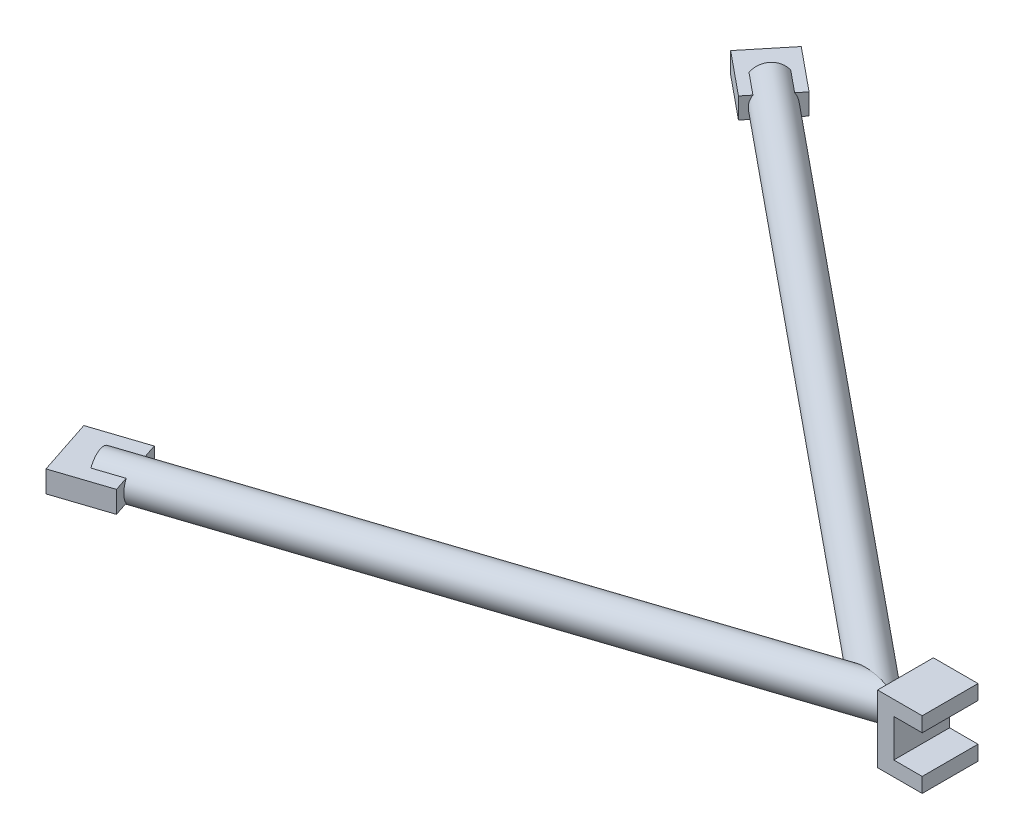
ISO-10303-21;
HEADER;
FILE_DESCRIPTION(('STEP AP214'),'2;1');
FILE_NAME('part.step','',(''),(''),'','','');
FILE_SCHEMA(('AUTOMOTIVE_DESIGN { 1 0 10303 214 1 1 1 1 }'));
ENDSEC;
DATA;
#1=APPLICATION_CONTEXT('core data for automotive mechanical design processes');
#2=APPLICATION_PROTOCOL_DEFINITION('international standard','automotive_design',2000,#1);
#3=PRODUCT_CONTEXT('',#1,'mechanical');
#4=PRODUCT('Part','Part','',(#3));
#5=PRODUCT_RELATED_PRODUCT_CATEGORY('part','',(#4));
#6=PRODUCT_DEFINITION_FORMATION('','',#4);
#7=PRODUCT_DEFINITION_CONTEXT('part definition',#1,'design');
#8=PRODUCT_DEFINITION('design','',#6,#7);
#9=PRODUCT_DEFINITION_SHAPE('','',#8);
#10=(LENGTH_UNIT() NAMED_UNIT(*) SI_UNIT(.MILLI.,.METRE.));
#11=(NAMED_UNIT(*) PLANE_ANGLE_UNIT() SI_UNIT($,.RADIAN.));
#12=(NAMED_UNIT(*) SI_UNIT($,.STERADIAN.) SOLID_ANGLE_UNIT());
#13=UNCERTAINTY_MEASURE_WITH_UNIT(LENGTH_MEASURE(1.E-05),#10,'distance_accuracy_value','');
#14=(GEOMETRIC_REPRESENTATION_CONTEXT(3) GLOBAL_UNCERTAINTY_ASSIGNED_CONTEXT((#13)) GLOBAL_UNIT_ASSIGNED_CONTEXT((#10,
#11,#12)) REPRESENTATION_CONTEXT('',''));
#15=CARTESIAN_POINT('',(0.,0.,0.));
#16=DIRECTION('',(0.,0.,1.));
#17=DIRECTION('',(1.,0.,0.));
#18=AXIS2_PLACEMENT_3D('',#15,#16,#17);
#19=CARTESIAN_POINT('',(-265.319834303481,0.,-217.222916666667));
#20=DIRECTION('',(-0.773752797618783,0.,-0.633487654320988));
#21=DIRECTION('',(-0.633487654320988,0.,0.773752797618783));
#22=AXIS2_PLACEMENT_3D('',#19,#20,#21);
#23=PLANE('',#22);
#24=DIRECTION('',(-0.633487654320988,0.,0.773752797618783));
#25=VECTOR('',#24,1.);
#26=CARTESIAN_POINT('',(-265.319834303481,-4.76050228622395,-217.222916666667));
#27=LINE('',#26,#25);
#28=CARTESIAN_POINT('',(-261.047541571658,-4.76050228622395,-222.441169036616));
#29=VERTEX_POINT('',#28);
#30=CARTESIAN_POINT('',(-269.592127035303,-4.76050228622395,-212.004664296718));
#31=VERTEX_POINT('',#30);
#32=EDGE_CURVE('E265',#29,#31,#27,.T.);
#33=ORIENTED_EDGE('',*,*,#32,.F.);
#34=CARTESIAN_POINT('',(-265.319834303481,0.,-217.222916666667));
#35=DIRECTION('',(-0.773752797618783,0.,-0.633487654320988));
#36=DIRECTION('',(-0.633487654320988,0.,0.773752797618783));
#37=AXIS2_PLACEMENT_3D('',#34,#35,#36);
#38=CIRCLE('',#37,8.25499999999999);
#39=EDGE_CURVE('E413',#29,#31,#38,.T.);
#40=ORIENTED_EDGE('',*,*,#39,.T.);
#41=EDGE_LOOP('',(#33,#40));
#42=FACE_BOUND('',#41,.T.);
#43=ADVANCED_FACE('F39',(#42),#23,.T.);
#44=CARTESIAN_POINT('',(-265.319834303481,0.,87.5770833333333));
#45=DIRECTION('',(0.949605706168506,0.,-0.31344696969697));
#46=DIRECTION('',(-0.31344696969697,0.,-0.949605706168506));
#47=AXIS2_PLACEMENT_3D('',#44,#45,#46);
#48=PLANE('',#47);
#49=CARTESIAN_POINT('',(-265.319834303481,0.,87.5770833333333));
#50=DIRECTION('',(0.949605706168506,0.,-0.31344696969697));
#51=DIRECTION('',(-0.31344696969697,0.,-0.949605706168506));
#52=AXIS2_PLACEMENT_3D('',#49,#50,#51);
#53=CIRCLE('',#52,8.25499999999999);
#54=CARTESIAN_POINT('',(-263.245783522506,-4.93573808779041,93.8605400162964));
#55=VERTEX_POINT('',#54);
#56=CARTESIAN_POINT('',(-267.393885084455,-4.93573808779042,81.2936266503703));
#57=VERTEX_POINT('',#56);
#58=EDGE_CURVE('E419',#55,#57,#53,.T.);
#59=ORIENTED_EDGE('',*,*,#58,.F.);
#60=DIRECTION('',(-0.31344696969697,0.,-0.949605706168506));
#61=VECTOR('',#60,1.);
#62=CARTESIAN_POINT('',(-265.319834303481,-4.93573808779042,87.5770833333333));
#63=LINE('',#62,#61);
#64=EDGE_CURVE('E317',#55,#57,#63,.T.);
#65=ORIENTED_EDGE('',*,*,#64,.T.);
#66=EDGE_LOOP('',(#59,#65));
#67=FACE_BOUND('',#66,.T.);
#68=ADVANCED_FACE('F487',(#67),#48,.F.);
#69=DIRECTION('',(0.633487654320988,0.,-0.773752797618783));
#70=VECTOR('',#69,1.);
#71=CARTESIAN_POINT('',(-265.319834303481,4.76050228622395,-217.222916666667));
#72=LINE('',#71,#70);
#73=CARTESIAN_POINT('',(-269.592127035303,4.76050228622395,-212.004664296718));
#74=VERTEX_POINT('',#73);
#75=CARTESIAN_POINT('',(-261.047541571658,4.76050228622395,-222.441169036616));
#76=VERTEX_POINT('',#75);
#77=EDGE_CURVE('E257',#74,#76,#72,.T.);
#78=ORIENTED_EDGE('',*,*,#77,.F.);
#79=EDGE_CURVE('E423',#74,#76,#38,.T.);
#80=ORIENTED_EDGE('',*,*,#79,.T.);
#81=EDGE_LOOP('',(#78,#80));
#82=FACE_BOUND('',#81,.T.);
#83=ADVANCED_FACE('F41',(#82),#23,.T.);
#84=CARTESIAN_POINT('',(-267.393885084455,4.93573808779041,81.2936266503703));
#85=VERTEX_POINT('',#84);
#86=CARTESIAN_POINT('',(-263.245783522506,4.93573808779042,93.8605400162964));
#87=VERTEX_POINT('',#86);
#88=EDGE_CURVE('E414',#85,#87,#53,.T.);
#89=ORIENTED_EDGE('',*,*,#88,.F.);
#90=DIRECTION('',(0.31344696969697,0.,0.949605706168506));
#91=VECTOR('',#90,1.);
#92=CARTESIAN_POINT('',(-265.319834303481,4.93573808779042,87.5770833333333));
#93=LINE('',#92,#91);
#94=EDGE_CURVE('E305',#85,#87,#93,.T.);
#95=ORIENTED_EDGE('',*,*,#94,.T.);
#96=EDGE_LOOP('',(#89,#95));
#97=FACE_BOUND('',#96,.T.);
#98=ADVANCED_FACE('F495',(#97),#48,.F.);
#99=CARTESIAN_POINT('',(12.8643448013669,0.,10.5323090755523));
#100=DIRECTION('',(-0.773752797618783,0.,-0.633487654320988));
#101=DIRECTION('',(-0.633487654320988,0.,0.773752797618783));
#102=AXIS2_PLACEMENT_3D('',#99,#100,#101);
#103=CYLINDRICAL_SURFACE('',#102,8.25499999999999);
#104=DIRECTION('',(-0.773752797618783,0.,-0.633487654320988));
#105=VECTOR('',#104,1.);
#106=CARTESIAN_POINT('',(17.1366375331891,-4.76050228622395,5.31405670560353));
#107=LINE('',#106,#105);
#108=CARTESIAN_POINT('',(-251.2208810419,-4.76050228622395,-214.395875826739));
#109=VERTEX_POINT('',#108);
#110=EDGE_CURVE('E11',#109,#29,#107,.T.);
#111=ORIENTED_EDGE('',*,*,#110,.F.);
#112=CARTESIAN_POINT('',(-255.493173773722,0.,-209.17762345679));
#113=DIRECTION('',(-0.773752797618783,0.,-0.633487654320988));
#114=DIRECTION('',(-0.633487654320988,0.,0.773752797618783));
#115=AXIS2_PLACEMENT_3D('',#112,#113,#114);
#116=CIRCLE('',#115,8.25499999999999);
#117=CARTESIAN_POINT('',(-251.2208810419,4.76050228622395,-214.395875826739));
#118=VERTEX_POINT('',#117);
#119=EDGE_CURVE('E452',#109,#118,#116,.F.);
#120=ORIENTED_EDGE('',*,*,#119,.T.);
#121=DIRECTION('',(-0.773752797618783,0.,-0.633487654320988));
#122=VECTOR('',#121,1.);
#123=CARTESIAN_POINT('',(17.1366375331891,4.76050228622395,5.31405670560353));
#124=LINE('',#123,#122);
#125=EDGE_CURVE('E48',#76,#118,#124,.F.);
#126=ORIENTED_EDGE('',*,*,#125,.F.);
#127=ORIENTED_EDGE('',*,*,#79,.F.);
#128=DIRECTION('',(-0.773752797618783,0.,-0.633487654320988));
#129=VECTOR('',#128,1.);
#130=CARTESIAN_POINT('',(8.59205206954476,4.76050228622395,15.7505614455011));
#131=LINE('',#130,#129);
#132=CARTESIAN_POINT('',(-259.765466505544,4.76050228622395,-203.959371086841));
#133=VERTEX_POINT('',#132);
#134=EDGE_CURVE('E451',#133,#74,#131,.T.);
#135=ORIENTED_EDGE('',*,*,#134,.F.);
#136=CARTESIAN_POINT('',(-259.765466505544,-4.76050228622395,-203.959371086841));
#137=VERTEX_POINT('',#136);
#138=EDGE_CURVE('E447',#133,#137,#116,.F.);
#139=ORIENTED_EDGE('',*,*,#138,.T.);
#140=DIRECTION('',(-0.773752797618783,0.,-0.633487654320988));
#141=VECTOR('',#140,1.);
#142=CARTESIAN_POINT('',(8.59205206954476,-4.76050228622395,15.7505614455011));
#143=LINE('',#142,#141);
#144=EDGE_CURVE('E455',#31,#137,#143,.F.);
#145=ORIENTED_EDGE('',*,*,#144,.F.);
#146=ORIENTED_EDGE('',*,*,#39,.F.);
#147=EDGE_LOOP('',(#111,#120,#126,#127,#135,#139,#145,#146));
#148=FACE_BOUND('',#147,.T.);
#149=CARTESIAN_POINT('',(13.6293656524409,0.,11.1586477019779));
#150=DIRECTION('',(-1.,0.,0.));
#151=DIRECTION('',(0.,0.,-1.));
#152=AXIS2_PLACEMENT_3D('',#149,#150,#151);
#153=ELLIPSE('',#152,10.6687821037994,8.25499999999999);
#154=CARTESIAN_POINT('',(13.6293656524409,-4.85605676273907,2.53107609636206));
#155=VERTEX_POINT('',#154);
#156=CARTESIAN_POINT('',(13.6293656524409,4.85605676273907,2.53107609636206));
#157=VERTEX_POINT('',#156);
#158=EDGE_CURVE('E389',#155,#157,#153,.F.);
#159=ORIENTED_EDGE('',*,*,#158,.F.);
#160=CARTESIAN_POINT('',(0.,0.,0.));
#161=DIRECTION('',(0.182585791656968,0.,-0.983189925032289));
#162=DIRECTION('',(0.983189925032289,0.,0.182585791656968));
#163=AXIS2_PLACEMENT_3D('',#160,#161,#162);
#164=ELLIPSE('',#163,17.1421186326536,8.25499999999999);
#165=EDGE_CURVE('E418',#157,#155,#164,.F.);
#166=ORIENTED_EDGE('',*,*,#165,.F.);
#167=EDGE_LOOP('',(#159,#166));
#168=FACE_BOUND('',#167,.T.);
#169=ADVANCED_FACE('F464',(#148,#168),#103,.T.);
#170=CARTESIAN_POINT('',(-265.319834303481,0.,87.5770833333333));
#171=DIRECTION('',(0.949605706168506,0.,-0.31344696969697));
#172=DIRECTION('',(-0.31344696969697,0.,-0.949605706168506));
#173=AXIS2_PLACEMENT_3D('',#170,#171,#172);
#174=CYLINDRICAL_SURFACE('',#173,8.25499999999999);
#175=DIRECTION('',(0.949605706168506,0.,-0.31344696969697));
#176=VECTOR('',#175,1.);
#177=CARTESIAN_POINT('',(-267.393885084455,-4.93573808779041,81.2936266503703));
#178=LINE('',#177,#176);
#179=CARTESIAN_POINT('',(-255.333892616115,-4.93573808779042,77.3128501352188));
#180=VERTEX_POINT('',#179);
#181=EDGE_CURVE('E444',#180,#57,#178,.F.);
#182=ORIENTED_EDGE('',*,*,#181,.F.);
#183=CARTESIAN_POINT('',(-253.25984183514,0.,83.5963068181818));
#184=DIRECTION('',(-0.949605706168506,0.,0.31344696969697));
#185=DIRECTION('',(0.31344696969697,0.,0.949605706168506));
#186=AXIS2_PLACEMENT_3D('',#183,#184,#185);
#187=CIRCLE('',#186,8.25499999999999);
#188=CARTESIAN_POINT('',(-255.333892616115,4.93573808779042,77.3128501352188));
#189=VERTEX_POINT('',#188);
#190=EDGE_CURVE('E435',#180,#189,#187,.F.);
#191=ORIENTED_EDGE('',*,*,#190,.T.);
#192=DIRECTION('',(0.949605706168506,0.,-0.31344696969697));
#193=VECTOR('',#192,1.);
#194=CARTESIAN_POINT('',(-267.393885084455,4.93573808779041,81.2936266503703));
#195=LINE('',#194,#193);
#196=EDGE_CURVE('E441',#85,#189,#195,.T.);
#197=ORIENTED_EDGE('',*,*,#196,.F.);
#198=ORIENTED_EDGE('',*,*,#88,.T.);
#199=DIRECTION('',(0.949605706168506,0.,-0.31344696969697));
#200=VECTOR('',#199,1.);
#201=CARTESIAN_POINT('',(-263.245783522506,4.93573808779041,93.8605400162964));
#202=LINE('',#201,#200);
#203=CARTESIAN_POINT('',(-251.185791054166,4.93573808779042,89.8797635011448));
#204=VERTEX_POINT('',#203);
#205=EDGE_CURVE('E434',#204,#87,#202,.F.);
#206=ORIENTED_EDGE('',*,*,#205,.F.);
#207=CARTESIAN_POINT('',(-251.185791054166,-4.93573808779042,89.8797635011448));
#208=VERTEX_POINT('',#207);
#209=EDGE_CURVE('E430',#204,#208,#187,.F.);
#210=ORIENTED_EDGE('',*,*,#209,.T.);
#211=DIRECTION('',(0.949605706168506,0.,-0.31344696969697));
#212=VECTOR('',#211,1.);
#213=CARTESIAN_POINT('',(-263.245783522506,-4.93573808779041,93.8605400162964));
#214=LINE('',#213,#212);
#215=EDGE_CURVE('E438',#55,#208,#214,.T.);
#216=ORIENTED_EDGE('',*,*,#215,.F.);
#217=ORIENTED_EDGE('',*,*,#58,.T.);
#218=EDGE_LOOP('',(#182,#191,#197,#198,#206,#210,#216,#217));
#219=FACE_BOUND('',#218,.T.);
#220=CARTESIAN_POINT('',(13.6293656524409,0.,-4.49879706376942));
#221=DIRECTION('',(-1.,0.,0.));
#222=DIRECTION('',(0.,0.,-1.));
#223=AXIS2_PLACEMENT_3D('',#220,#221,#222);
#224=ELLIPSE('',#223,8.69308171420692,8.25499999999999);
#225=EDGE_CURVE('E422',#157,#155,#224,.F.);
#226=ORIENTED_EDGE('',*,*,#225,.F.);
#227=ORIENTED_EDGE('',*,*,#165,.T.);
#228=EDGE_LOOP('',(#226,#227));
#229=FACE_BOUND('',#228,.T.);
#230=ADVANCED_FACE('F496',(#219,#229),#174,.T.);
#231=CARTESIAN_POINT('',(33.9317533676103,8.5937968108698,-12.7));
#232=DIRECTION('',(1.,0.,0.));
#233=DIRECTION('',(0.,1.,0.));
#234=AXIS2_PLACEMENT_3D('',#231,#232,#233);
#235=PLANE('',#234);
#236=DIRECTION('',(0.,0.,1.));
#237=VECTOR('',#236,1.);
#238=CARTESIAN_POINT('',(33.9317533676103,15.315544540046,-12.7));
#239=LINE('',#238,#237);
#240=CARTESIAN_POINT('',(33.9317533676103,15.315544540046,-12.7));
#241=VERTEX_POINT('',#240);
#242=CARTESIAN_POINT('',(33.9317533676103,15.315544540046,12.7));
#243=VERTEX_POINT('',#242);
#244=EDGE_CURVE('E385',#241,#243,#239,.T.);
#245=ORIENTED_EDGE('',*,*,#244,.T.);
#246=DIRECTION('',(0.,1.,0.));
#247=VECTOR('',#246,1.);
#248=CARTESIAN_POINT('',(33.9317533676103,8.5937968108698,12.7));
#249=LINE('',#248,#247);
#250=CARTESIAN_POINT('',(33.9317533676103,8.5937968108698,12.7));
#251=VERTEX_POINT('',#250);
#252=EDGE_CURVE('E321',#251,#243,#249,.T.);
#253=ORIENTED_EDGE('',*,*,#252,.F.);
#254=DIRECTION('',(0.,0.,1.));
#255=VECTOR('',#254,1.);
#256=CARTESIAN_POINT('',(33.9317533676103,8.5937968108698,-12.7));
#257=LINE('',#256,#255);
#258=CARTESIAN_POINT('',(33.9317533676103,8.5937968108698,-12.7));
#259=VERTEX_POINT('',#258);
#260=EDGE_CURVE('E386',#259,#251,#257,.T.);
#261=ORIENTED_EDGE('',*,*,#260,.F.);
#262=DIRECTION('',(0.,1.,0.));
#263=VECTOR('',#262,1.);
#264=CARTESIAN_POINT('',(33.9317533676103,8.5937968108698,-12.7));
#265=LINE('',#264,#263);
#266=EDGE_CURVE('E353',#259,#241,#265,.T.);
#267=ORIENTED_EDGE('',*,*,#266,.T.);
#268=EDGE_LOOP('',(#245,#253,#261,#267));
#269=FACE_BOUND('',#268,.T.);
#270=ADVANCED_FACE('F498',(#269),#235,.T.);
#271=CARTESIAN_POINT('',(21.0045844286355,8.5937968108698,-12.7));
#272=DIRECTION('',(0.,-1.,0.));
#273=DIRECTION('',(0.,0.,-1.));
#274=AXIS2_PLACEMENT_3D('',#271,#272,#273);
#275=PLANE('',#274);
#276=ORIENTED_EDGE('',*,*,#260,.T.);
#277=DIRECTION('',(1.,0.,0.));
#278=VECTOR('',#277,1.);
#279=CARTESIAN_POINT('',(21.0045844286355,8.5937968108698,12.7));
#280=LINE('',#279,#278);
#281=CARTESIAN_POINT('',(21.0045844286355,8.5937968108698,12.7));
#282=VERTEX_POINT('',#281);
#283=EDGE_CURVE('E349',#282,#251,#280,.T.);
#284=ORIENTED_EDGE('',*,*,#283,.F.);
#285=DIRECTION('',(0.,0.,1.));
#286=VECTOR('',#285,1.);
#287=CARTESIAN_POINT('',(21.0045844286355,8.5937968108698,-12.7));
#288=LINE('',#287,#286);
#289=CARTESIAN_POINT('',(21.0045844286355,8.5937968108698,-12.7));
#290=VERTEX_POINT('',#289);
#291=EDGE_CURVE('E390',#290,#282,#288,.T.);
#292=ORIENTED_EDGE('',*,*,#291,.F.);
#293=DIRECTION('',(1.,0.,0.));
#294=VECTOR('',#293,1.);
#295=CARTESIAN_POINT('',(21.0045844286355,8.5937968108698,-12.7));
#296=LINE('',#295,#294);
#297=EDGE_CURVE('E381',#290,#259,#296,.T.);
#298=ORIENTED_EDGE('',*,*,#297,.T.);
#299=EDGE_LOOP('',(#276,#284,#292,#298));
#300=FACE_BOUND('',#299,.T.);
#301=ADVANCED_FACE('F506',(#300),#275,.T.);
#302=CARTESIAN_POINT('',(21.0045844286355,-8.5937968108698,-12.7));
#303=DIRECTION('',(1.,0.,0.));
#304=DIRECTION('',(0.,1.,0.));
#305=AXIS2_PLACEMENT_3D('',#302,#303,#304);
#306=PLANE('',#305);
#307=ORIENTED_EDGE('',*,*,#291,.T.);
#308=DIRECTION('',(0.,1.,0.));
#309=VECTOR('',#308,1.);
#310=CARTESIAN_POINT('',(21.0045844286355,-8.5937968108698,12.7));
#311=LINE('',#310,#309);
#312=CARTESIAN_POINT('',(21.0045844286355,-8.5937968108698,12.7));
#313=VERTEX_POINT('',#312);
#314=EDGE_CURVE('E345',#313,#282,#311,.T.);
#315=ORIENTED_EDGE('',*,*,#314,.F.);
#316=DIRECTION('',(0.,0.,1.));
#317=VECTOR('',#316,1.);
#318=CARTESIAN_POINT('',(21.0045844286355,-8.5937968108698,-12.7));
#319=LINE('',#318,#317);
#320=CARTESIAN_POINT('',(21.0045844286355,-8.5937968108698,-12.7));
#321=VERTEX_POINT('',#320);
#322=EDGE_CURVE('E393',#321,#313,#319,.T.);
#323=ORIENTED_EDGE('',*,*,#322,.F.);
#324=DIRECTION('',(0.,1.,0.));
#325=VECTOR('',#324,1.);
#326=CARTESIAN_POINT('',(21.0045844286355,-8.5937968108698,-12.7));
#327=LINE('',#326,#325);
#328=EDGE_CURVE('E377',#321,#290,#327,.T.);
#329=ORIENTED_EDGE('',*,*,#328,.T.);
#330=EDGE_LOOP('',(#307,#315,#323,#329));
#331=FACE_BOUND('',#330,.T.);
#332=ADVANCED_FACE('F513',(#331),#306,.T.);
#333=CARTESIAN_POINT('',(33.9317533676103,-8.59379681086979,-12.7));
#334=DIRECTION('',(0.,1.,0.));
#335=DIRECTION('',(-1.,0.,0.));
#336=AXIS2_PLACEMENT_3D('',#333,#334,#335);
#337=PLANE('',#336);
#338=ORIENTED_EDGE('',*,*,#322,.T.);
#339=DIRECTION('',(-1.,0.,0.));
#340=VECTOR('',#339,1.);
#341=CARTESIAN_POINT('',(33.9317533676103,-8.59379681086979,12.7));
#342=LINE('',#341,#340);
#343=CARTESIAN_POINT('',(33.9317533676103,-8.59379681086979,12.7));
#344=VERTEX_POINT('',#343);
#345=EDGE_CURVE('E341',#344,#313,#342,.T.);
#346=ORIENTED_EDGE('',*,*,#345,.F.);
#347=DIRECTION('',(0.,0.,1.));
#348=VECTOR('',#347,1.);
#349=CARTESIAN_POINT('',(33.9317533676103,-8.59379681086979,-12.7));
#350=LINE('',#349,#348);
#351=CARTESIAN_POINT('',(33.9317533676103,-8.59379681086979,-12.7));
#352=VERTEX_POINT('',#351);
#353=EDGE_CURVE('E396',#352,#344,#350,.T.);
#354=ORIENTED_EDGE('',*,*,#353,.F.);
#355=DIRECTION('',(-1.,0.,0.));
#356=VECTOR('',#355,1.);
#357=CARTESIAN_POINT('',(33.9317533676103,-8.59379681086979,-12.7));
#358=LINE('',#357,#356);
#359=EDGE_CURVE('E373',#352,#321,#358,.T.);
#360=ORIENTED_EDGE('',*,*,#359,.T.);
#361=EDGE_LOOP('',(#338,#346,#354,#360));
#362=FACE_BOUND('',#361,.T.);
#363=ADVANCED_FACE('F640',(#362),#337,.T.);
#364=CARTESIAN_POINT('',(33.9317533676103,-15.315544540046,-12.7));
#365=DIRECTION('',(1.,0.,0.));
#366=DIRECTION('',(0.,0.,-1.));
#367=AXIS2_PLACEMENT_3D('',#364,#365,#366);
#368=PLANE('',#367);
#369=ORIENTED_EDGE('',*,*,#353,.T.);
#370=DIRECTION('',(0.,1.,0.));
#371=VECTOR('',#370,1.);
#372=CARTESIAN_POINT('',(33.9317533676103,-15.315544540046,12.7));
#373=LINE('',#372,#371);
#374=CARTESIAN_POINT('',(33.9317533676103,-15.315544540046,12.7));
#375=VERTEX_POINT('',#374);
#376=EDGE_CURVE('E337',#375,#344,#373,.T.);
#377=ORIENTED_EDGE('',*,*,#376,.F.);
#378=DIRECTION('',(0.,0.,1.));
#379=VECTOR('',#378,1.);
#380=CARTESIAN_POINT('',(33.9317533676103,-15.315544540046,-12.7));
#381=LINE('',#380,#379);
#382=CARTESIAN_POINT('',(33.9317533676103,-15.315544540046,-12.7));
#383=VERTEX_POINT('',#382);
#384=EDGE_CURVE('E399',#383,#375,#381,.T.);
#385=ORIENTED_EDGE('',*,*,#384,.F.);
#386=DIRECTION('',(0.,1.,0.));
#387=VECTOR('',#386,1.);
#388=CARTESIAN_POINT('',(33.9317533676103,-15.315544540046,-12.7));
#389=LINE('',#388,#387);
#390=EDGE_CURVE('E369',#383,#352,#389,.T.);
#391=ORIENTED_EDGE('',*,*,#390,.T.);
#392=EDGE_LOOP('',(#369,#377,#385,#391));
#393=FACE_BOUND('',#392,.T.);
#394=ADVANCED_FACE('F644',(#393),#368,.T.);
#395=CARTESIAN_POINT('',(13.6293656524409,-15.315544540046,-12.7));
#396=DIRECTION('',(0.,-1.,0.));
#397=DIRECTION('',(0.,0.,-1.));
#398=AXIS2_PLACEMENT_3D('',#395,#396,#397);
#399=PLANE('',#398);
#400=ORIENTED_EDGE('',*,*,#384,.T.);
#401=DIRECTION('',(1.,0.,0.));
#402=VECTOR('',#401,1.);
#403=CARTESIAN_POINT('',(13.6293656524409,-15.315544540046,12.7));
#404=LINE('',#403,#402);
#405=CARTESIAN_POINT('',(13.6293656524409,-15.315544540046,12.7));
#406=VERTEX_POINT('',#405);
#407=EDGE_CURVE('E333',#406,#375,#404,.T.);
#408=ORIENTED_EDGE('',*,*,#407,.F.);
#409=DIRECTION('',(0.,0.,1.));
#410=VECTOR('',#409,1.);
#411=CARTESIAN_POINT('',(13.6293656524409,-15.315544540046,-12.7));
#412=LINE('',#411,#410);
#413=CARTESIAN_POINT('',(13.6293656524409,-15.315544540046,-12.7));
#414=VERTEX_POINT('',#413);
#415=EDGE_CURVE('E402',#414,#406,#412,.T.);
#416=ORIENTED_EDGE('',*,*,#415,.F.);
#417=DIRECTION('',(1.,0.,0.));
#418=VECTOR('',#417,1.);
#419=CARTESIAN_POINT('',(13.6293656524409,-15.315544540046,-12.7));
#420=LINE('',#419,#418);
#421=EDGE_CURVE('E365',#414,#383,#420,.T.);
#422=ORIENTED_EDGE('',*,*,#421,.T.);
#423=EDGE_LOOP('',(#400,#408,#416,#422));
#424=FACE_BOUND('',#423,.T.);
#425=ADVANCED_FACE('F648',(#424),#399,.T.);
#426=CARTESIAN_POINT('',(13.6293656524409,15.315544540046,-12.7));
#427=DIRECTION('',(-1.,0.,0.));
#428=DIRECTION('',(0.,-1.,0.));
#429=AXIS2_PLACEMENT_3D('',#426,#427,#428);
#430=PLANE('',#429);
#431=ORIENTED_EDGE('',*,*,#225,.T.);
#432=ORIENTED_EDGE('',*,*,#158,.T.);
#433=EDGE_LOOP('',(#431,#432));
#434=FACE_BOUND('',#433,.T.);
#435=ORIENTED_EDGE('',*,*,#415,.T.);
#436=DIRECTION('',(0.,-1.,0.));
#437=VECTOR('',#436,1.);
#438=CARTESIAN_POINT('',(13.6293656524409,15.315544540046,12.7));
#439=LINE('',#438,#437);
#440=CARTESIAN_POINT('',(13.6293656524409,15.315544540046,12.7));
#441=VERTEX_POINT('',#440);
#442=EDGE_CURVE('E329',#441,#406,#439,.T.);
#443=ORIENTED_EDGE('',*,*,#442,.F.);
#444=DIRECTION('',(0.,0.,1.));
#445=VECTOR('',#444,1.);
#446=CARTESIAN_POINT('',(13.6293656524409,15.315544540046,-12.7));
#447=LINE('',#446,#445);
#448=CARTESIAN_POINT('',(13.6293656524409,15.315544540046,-12.7));
#449=VERTEX_POINT('',#448);
#450=EDGE_CURVE('E405',#449,#441,#447,.T.);
#451=ORIENTED_EDGE('',*,*,#450,.F.);
#452=DIRECTION('',(0.,-1.,0.));
#453=VECTOR('',#452,1.);
#454=CARTESIAN_POINT('',(13.6293656524409,15.315544540046,-12.7));
#455=LINE('',#454,#453);
#456=EDGE_CURVE('E361',#449,#414,#455,.T.);
#457=ORIENTED_EDGE('',*,*,#456,.T.);
#458=EDGE_LOOP('',(#435,#443,#451,#457));
#459=FACE_BOUND('',#458,.T.);
#460=ADVANCED_FACE('F651',(#434,#459),#430,.T.);
#461=CARTESIAN_POINT('',(33.9317533676103,15.315544540046,-12.7));
#462=DIRECTION('',(0.,1.,0.));
#463=DIRECTION('',(-1.,0.,0.));
#464=AXIS2_PLACEMENT_3D('',#461,#462,#463);
#465=PLANE('',#464);
#466=ORIENTED_EDGE('',*,*,#450,.T.);
#467=DIRECTION('',(-1.,0.,0.));
#468=VECTOR('',#467,1.);
#469=CARTESIAN_POINT('',(33.9317533676103,15.315544540046,12.7));
#470=LINE('',#469,#468);
#471=EDGE_CURVE('E325',#243,#441,#470,.T.);
#472=ORIENTED_EDGE('',*,*,#471,.F.);
#473=ORIENTED_EDGE('',*,*,#244,.F.);
#474=DIRECTION('',(-1.,0.,0.));
#475=VECTOR('',#474,1.);
#476=CARTESIAN_POINT('',(33.9317533676103,15.315544540046,-12.7));
#477=LINE('',#476,#475);
#478=EDGE_CURVE('E357',#241,#449,#477,.T.);
#479=ORIENTED_EDGE('',*,*,#478,.T.);
#480=EDGE_LOOP('',(#466,#472,#473,#479));
#481=FACE_BOUND('',#480,.T.);
#482=ADVANCED_FACE('F520',(#481),#465,.T.);
#483=CARTESIAN_POINT('',(0.,0.,-12.7));
#484=DIRECTION('',(0.,0.,1.));
#485=DIRECTION('',(1.,0.,0.));
#486=AXIS2_PLACEMENT_3D('',#483,#484,#485);
#487=PLANE('',#486);
#488=ORIENTED_EDGE('',*,*,#266,.F.);
#489=ORIENTED_EDGE('',*,*,#297,.F.);
#490=ORIENTED_EDGE('',*,*,#328,.F.);
#491=ORIENTED_EDGE('',*,*,#359,.F.);
#492=ORIENTED_EDGE('',*,*,#390,.F.);
#493=ORIENTED_EDGE('',*,*,#421,.F.);
#494=ORIENTED_EDGE('',*,*,#456,.F.);
#495=ORIENTED_EDGE('',*,*,#478,.F.);
#496=EDGE_LOOP('',(#488,#489,#490,#491,#492,#493,#494,#495));
#497=FACE_BOUND('',#496,.T.);
#498=ADVANCED_FACE('F633',(#497),#487,.F.);
#499=CARTESIAN_POINT('',(0.,0.,12.7));
#500=DIRECTION('',(0.,0.,1.));
#501=DIRECTION('',(1.,0.,0.));
#502=AXIS2_PLACEMENT_3D('',#499,#500,#501);
#503=PLANE('',#502);
#504=ORIENTED_EDGE('',*,*,#252,.T.);
#505=ORIENTED_EDGE('',*,*,#471,.T.);
#506=ORIENTED_EDGE('',*,*,#442,.T.);
#507=ORIENTED_EDGE('',*,*,#407,.T.);
#508=ORIENTED_EDGE('',*,*,#376,.T.);
#509=ORIENTED_EDGE('',*,*,#345,.T.);
#510=ORIENTED_EDGE('',*,*,#314,.T.);
#511=ORIENTED_EDGE('',*,*,#283,.T.);
#512=EDGE_LOOP('',(#504,#505,#506,#507,#508,#509,#510,#511));
#513=FACE_BOUND('',#512,.T.);
#514=ADVANCED_FACE('F630',(#513),#503,.T.);
#515=CARTESIAN_POINT('',(-253.25984183514,0.,83.5963068181818));
#516=DIRECTION('',(-0.949605706168506,0.,0.31344696969697));
#517=DIRECTION('',(0.31344696969697,0.,0.949605706168506));
#518=AXIS2_PLACEMENT_3D('',#515,#516,#517);
#519=PLANE('',#518);
#520=ORIENTED_EDGE('',*,*,#190,.F.);
#521=DIRECTION('',(0.31344696969697,0.,0.949605706168506));
#522=VECTOR('',#521,1.);
#523=CARTESIAN_POINT('',(-257.498286036114,-4.93573808779042,70.7556952071885));
#524=LINE('',#523,#522);
#525=CARTESIAN_POINT('',(-257.498286036114,-4.93573808779042,70.7556952071885));
#526=VERTEX_POINT('',#525);
#527=EDGE_CURVE('E297',#526,#180,#524,.T.);
#528=ORIENTED_EDGE('',*,*,#527,.F.);
#529=DIRECTION('',(0.,-1.,0.));
#530=VECTOR('',#529,1.);
#531=CARTESIAN_POINT('',(-257.498286036114,4.93573808779042,70.7556952071885));
#532=LINE('',#531,#530);
#533=CARTESIAN_POINT('',(-257.498286036114,4.93573808779042,70.7556952071885));
#534=VERTEX_POINT('',#533);
#535=EDGE_CURVE('E293',#534,#526,#532,.T.);
#536=ORIENTED_EDGE('',*,*,#535,.F.);
#537=DIRECTION('',(-0.31344696969697,0.,-0.949605706168506));
#538=VECTOR('',#537,1.);
#539=CARTESIAN_POINT('',(-257.498286036114,4.93573808779042,70.7556952071885));
#540=LINE('',#539,#538);
#541=EDGE_CURVE('E288',#189,#534,#540,.T.);
#542=ORIENTED_EDGE('',*,*,#541,.F.);
#543=EDGE_LOOP('',(#520,#528,#536,#542));
#544=FACE_BOUND('',#543,.T.);
#545=ADVANCED_FACE('F599',(#544),#519,.F.);
#546=CARTESIAN_POINT('',(-249.021397634167,4.93573808779042,96.4369184291752));
#547=DIRECTION('',(0.31344696969697,0.,0.949605706168506));
#548=DIRECTION('',(0.949605706168506,0.,-0.31344696969697));
#549=AXIS2_PLACEMENT_3D('',#546,#547,#548);
#550=PLANE('',#549);
#551=DIRECTION('',(-0.949605706168506,0.,0.31344696969697));
#552=VECTOR('',#551,1.);
#553=CARTESIAN_POINT('',(-249.021397634167,4.93573808779042,96.4369184291752));
#554=LINE('',#553,#552);
#555=CARTESIAN_POINT('',(-249.021397634167,4.93573808779042,96.4369184291752));
#556=VERTEX_POINT('',#555);
#557=CARTESIAN_POINT('',(-273.141382570847,4.93573808779042,104.398471459478));
#558=VERTEX_POINT('',#557);
#559=EDGE_CURVE('E301',#556,#558,#554,.T.);
#560=ORIENTED_EDGE('',*,*,#559,.T.);
#561=DIRECTION('',(0.,1.,0.));
#562=VECTOR('',#561,1.);
#563=CARTESIAN_POINT('',(-273.141382570847,4.93573808779042,104.398471459478));
#564=LINE('',#563,#562);
#565=CARTESIAN_POINT('',(-273.141382570847,-4.93573808779042,104.398471459478));
#566=VERTEX_POINT('',#565);
#567=EDGE_CURVE('E268',#566,#558,#564,.T.);
#568=ORIENTED_EDGE('',*,*,#567,.F.);
#569=DIRECTION('',(-0.949605706168506,0.,0.31344696969697));
#570=VECTOR('',#569,1.);
#571=CARTESIAN_POINT('',(-249.021397634167,-4.93573808779042,96.4369184291752));
#572=LINE('',#571,#570);
#573=CARTESIAN_POINT('',(-249.021397634167,-4.93573808779042,96.4369184291752));
#574=VERTEX_POINT('',#573);
#575=EDGE_CURVE('E302',#574,#566,#572,.T.);
#576=ORIENTED_EDGE('',*,*,#575,.F.);
#577=DIRECTION('',(0.,1.,0.));
#578=VECTOR('',#577,1.);
#579=CARTESIAN_POINT('',(-249.021397634167,4.93573808779042,96.4369184291752));
#580=LINE('',#579,#578);
#581=EDGE_CURVE('E284',#574,#556,#580,.T.);
#582=ORIENTED_EDGE('',*,*,#581,.T.);
#583=EDGE_LOOP('',(#560,#568,#576,#582));
#584=FACE_BOUND('',#583,.T.);
#585=ADVANCED_FACE('F615',(#584),#550,.T.);
#586=CARTESIAN_POINT('',(-257.498286036114,-4.93573808779042,70.7556952071885));
#587=DIRECTION('',(0.,-1.,0.));
#588=DIRECTION('',(0.,0.,-1.));
#589=AXIS2_PLACEMENT_3D('',#586,#587,#588);
#590=PLANE('',#589);
#591=ORIENTED_EDGE('',*,*,#527,.T.);
#592=ORIENTED_EDGE('',*,*,#181,.T.);
#593=ORIENTED_EDGE('',*,*,#64,.F.);
#594=ORIENTED_EDGE('',*,*,#215,.T.);
#595=EDGE_CURVE('E63',#208,#574,#524,.T.);
#596=ORIENTED_EDGE('',*,*,#595,.T.);
#597=ORIENTED_EDGE('',*,*,#575,.T.);
#598=DIRECTION('',(0.31344696969697,0.,0.949605706168506));
#599=VECTOR('',#598,1.);
#600=CARTESIAN_POINT('',(-281.618270972794,-4.93573808779042,78.7172482374915));
#601=LINE('',#600,#599);
#602=CARTESIAN_POINT('',(-281.618270972794,-4.93573808779042,78.7172482374915));
#603=VERTEX_POINT('',#602);
#604=EDGE_CURVE('E280',#603,#566,#601,.T.);
#605=ORIENTED_EDGE('',*,*,#604,.F.);
#606=DIRECTION('',(-0.949605706168506,0.,0.31344696969697));
#607=VECTOR('',#606,1.);
#608=CARTESIAN_POINT('',(-257.498286036114,-4.93573808779042,70.7556952071885));
#609=LINE('',#608,#607);
#610=EDGE_CURVE('E306',#526,#603,#609,.T.);
#611=ORIENTED_EDGE('',*,*,#610,.F.);
#612=EDGE_LOOP('',(#591,#592,#593,#594,#596,#597,#605,#611));
#613=FACE_BOUND('',#612,.T.);
#614=ADVANCED_FACE('F602',(#613),#590,.T.);
#615=CARTESIAN_POINT('',(-257.498286036114,4.93573808779042,70.7556952071885));
#616=DIRECTION('',(-0.31344696969697,0.,-0.949605706168506));
#617=DIRECTION('',(-0.949605706168506,0.,0.31344696969697));
#618=AXIS2_PLACEMENT_3D('',#615,#616,#617);
#619=PLANE('',#618);
#620=ORIENTED_EDGE('',*,*,#610,.T.);
#621=DIRECTION('',(0.,-1.,0.));
#622=VECTOR('',#621,1.);
#623=CARTESIAN_POINT('',(-281.618270972794,4.93573808779042,78.7172482374915));
#624=LINE('',#623,#622);
#625=CARTESIAN_POINT('',(-281.618270972794,4.93573808779042,78.7172482374915));
#626=VERTEX_POINT('',#625);
#627=EDGE_CURVE('E276',#626,#603,#624,.T.);
#628=ORIENTED_EDGE('',*,*,#627,.F.);
#629=DIRECTION('',(-0.949605706168506,0.,0.31344696969697));
#630=VECTOR('',#629,1.);
#631=CARTESIAN_POINT('',(-257.498286036114,4.93573808779042,70.7556952071885));
#632=LINE('',#631,#630);
#633=EDGE_CURVE('E309',#534,#626,#632,.T.);
#634=ORIENTED_EDGE('',*,*,#633,.F.);
#635=ORIENTED_EDGE('',*,*,#535,.T.);
#636=EDGE_LOOP('',(#620,#628,#634,#635));
#637=FACE_BOUND('',#636,.T.);
#638=ADVANCED_FACE('F597',(#637),#619,.T.);
#639=CARTESIAN_POINT('',(-257.498286036114,4.93573808779042,70.7556952071885));
#640=DIRECTION('',(0.,1.,0.));
#641=DIRECTION('',(0.,0.,1.));
#642=AXIS2_PLACEMENT_3D('',#639,#640,#641);
#643=PLANE('',#642);
#644=EDGE_CURVE('E289',#556,#204,#540,.T.);
#645=ORIENTED_EDGE('',*,*,#644,.T.);
#646=ORIENTED_EDGE('',*,*,#205,.T.);
#647=ORIENTED_EDGE('',*,*,#94,.F.);
#648=ORIENTED_EDGE('',*,*,#196,.T.);
#649=ORIENTED_EDGE('',*,*,#541,.T.);
#650=ORIENTED_EDGE('',*,*,#633,.T.);
#651=DIRECTION('',(-0.31344696969697,0.,-0.949605706168506));
#652=VECTOR('',#651,1.);
#653=CARTESIAN_POINT('',(-281.618270972794,4.93573808779042,78.7172482374915));
#654=LINE('',#653,#652);
#655=EDGE_CURVE('E272',#558,#626,#654,.T.);
#656=ORIENTED_EDGE('',*,*,#655,.F.);
#657=ORIENTED_EDGE('',*,*,#559,.F.);
#658=EDGE_LOOP('',(#645,#646,#647,#648,#649,#650,#656,#657));
#659=FACE_BOUND('',#658,.T.);
#660=ADVANCED_FACE('F589',(#659),#643,.T.);
#661=ORIENTED_EDGE('',*,*,#209,.F.);
#662=ORIENTED_EDGE('',*,*,#644,.F.);
#663=ORIENTED_EDGE('',*,*,#581,.F.);
#664=ORIENTED_EDGE('',*,*,#595,.F.);
#665=EDGE_LOOP('',(#661,#662,#663,#664));
#666=FACE_BOUND('',#665,.T.);
#667=ADVANCED_FACE('F612',(#666),#519,.F.);
#668=CARTESIAN_POINT('',(-277.379826771821,0.,91.5578598484849));
#669=DIRECTION('',(-0.949605706168506,0.,0.31344696969697));
#670=DIRECTION('',(0.31344696969697,0.,0.949605706168506));
#671=AXIS2_PLACEMENT_3D('',#668,#669,#670);
#672=PLANE('',#671);
#673=ORIENTED_EDGE('',*,*,#567,.T.);
#674=ORIENTED_EDGE('',*,*,#655,.T.);
#675=ORIENTED_EDGE('',*,*,#627,.T.);
#676=ORIENTED_EDGE('',*,*,#604,.T.);
#677=EDGE_LOOP('',(#673,#674,#675,#676));
#678=FACE_BOUND('',#677,.T.);
#679=ADVANCED_FACE('F533',(#678),#672,.T.);
#680=CARTESIAN_POINT('',(-255.493173773722,0.,-209.17762345679));
#681=DIRECTION('',(-0.773752797618783,0.,-0.633487654320988));
#682=DIRECTION('',(-0.633487654320988,0.,0.773752797618783));
#683=AXIS2_PLACEMENT_3D('',#680,#681,#682);
#684=PLANE('',#683);
#685=ORIENTED_EDGE('',*,*,#119,.F.);
#686=DIRECTION('',(-0.633487654320988,0.,0.773752797618783));
#687=VECTOR('',#686,1.);
#688=CARTESIAN_POINT('',(-248.25884265912,-4.76050228622395,-218.013760831596));
#689=LINE('',#688,#687);
#690=CARTESIAN_POINT('',(-248.25884265912,-4.76050228622395,-218.013760831596));
#691=VERTEX_POINT('',#690);
#692=EDGE_CURVE('E218',#691,#109,#689,.T.);
#693=ORIENTED_EDGE('',*,*,#692,.F.);
#694=DIRECTION('',(0.,-1.,0.));
#695=VECTOR('',#694,1.);
#696=CARTESIAN_POINT('',(-248.25884265912,4.76050228622395,-218.013760831596));
#697=LINE('',#696,#695);
#698=CARTESIAN_POINT('',(-248.25884265912,4.76050228622395,-218.013760831596));
#699=VERTEX_POINT('',#698);
#700=EDGE_CURVE('E247',#699,#691,#697,.T.);
#701=ORIENTED_EDGE('',*,*,#700,.F.);
#702=DIRECTION('',(0.633487654320988,0.,-0.773752797618783));
#703=VECTOR('',#702,1.);
#704=CARTESIAN_POINT('',(-248.25884265912,4.76050228622395,-218.013760831596));
#705=LINE('',#704,#703);
#706=EDGE_CURVE('E243',#118,#699,#705,.T.);
#707=ORIENTED_EDGE('',*,*,#706,.F.);
#708=EDGE_LOOP('',(#685,#693,#701,#707));
#709=FACE_BOUND('',#708,.T.);
#710=ADVANCED_FACE('F470',(#709),#684,.F.);
#711=CARTESIAN_POINT('',(-262.727504888324,4.76050228622395,-200.341486081985));
#712=DIRECTION('',(-0.633487654320988,0.,0.773752797618782));
#713=DIRECTION('',(0.773752797618782,0.,0.633487654320988));
#714=AXIS2_PLACEMENT_3D('',#711,#712,#713);
#715=PLANE('',#714);
#716=DIRECTION('',(-0.773752797618782,0.,-0.633487654320988));
#717=VECTOR('',#716,1.);
#718=CARTESIAN_POINT('',(-262.727504888324,4.76050228622395,-200.341486081985));
#719=LINE('',#718,#717);
#720=CARTESIAN_POINT('',(-262.727504888324,4.76050228622395,-200.341486081985));
#721=VERTEX_POINT('',#720);
#722=CARTESIAN_POINT('',(-282.380825947841,4.76050228622395,-216.432072501738));
#723=VERTEX_POINT('',#722);
#724=EDGE_CURVE('E206',#721,#723,#719,.T.);
#725=ORIENTED_EDGE('',*,*,#724,.T.);
#726=DIRECTION('',(0.,1.,0.));
#727=VECTOR('',#726,1.);
#728=CARTESIAN_POINT('',(-282.380825947841,4.76050228622395,-216.432072501738));
#729=LINE('',#728,#727);
#730=CARTESIAN_POINT('',(-282.380825947841,-4.76050228622395,-216.432072501738));
#731=VERTEX_POINT('',#730);
#732=EDGE_CURVE('E211',#731,#723,#729,.T.);
#733=ORIENTED_EDGE('',*,*,#732,.F.);
#734=DIRECTION('',(-0.773752797618782,0.,-0.633487654320988));
#735=VECTOR('',#734,1.);
#736=CARTESIAN_POINT('',(-262.727504888324,-4.76050228622395,-200.341486081985));
#737=LINE('',#736,#735);
#738=CARTESIAN_POINT('',(-262.727504888324,-4.76050228622395,-200.341486081985));
#739=VERTEX_POINT('',#738);
#740=EDGE_CURVE('E254',#739,#731,#737,.T.);
#741=ORIENTED_EDGE('',*,*,#740,.F.);
#742=DIRECTION('',(0.,1.,0.));
#743=VECTOR('',#742,1.);
#744=CARTESIAN_POINT('',(-262.727504888324,4.76050228622395,-200.341486081985));
#745=LINE('',#744,#743);
#746=EDGE_CURVE('E212',#739,#721,#745,.T.);
#747=ORIENTED_EDGE('',*,*,#746,.T.);
#748=EDGE_LOOP('',(#725,#733,#741,#747));
#749=FACE_BOUND('',#748,.T.);
#750=ADVANCED_FACE('F208',(#749),#715,.T.);
#751=CARTESIAN_POINT('',(-248.25884265912,-4.76050228622395,-218.013760831596));
#752=DIRECTION('',(0.,-1.,0.));
#753=DIRECTION('',(0.,0.,-1.));
#754=AXIS2_PLACEMENT_3D('',#751,#752,#753);
#755=PLANE('',#754);
#756=ORIENTED_EDGE('',*,*,#32,.T.);
#757=ORIENTED_EDGE('',*,*,#144,.T.);
#758=EDGE_CURVE('E55',#137,#739,#689,.T.);
#759=ORIENTED_EDGE('',*,*,#758,.T.);
#760=ORIENTED_EDGE('',*,*,#740,.T.);
#761=DIRECTION('',(-0.633487654320988,0.,0.773752797618783));
#762=VECTOR('',#761,1.);
#763=CARTESIAN_POINT('',(-267.912163718637,-4.76050228622395,-234.104347251349));
#764=LINE('',#763,#762);
#765=CARTESIAN_POINT('',(-267.912163718637,-4.76050228622395,-234.104347251349));
#766=VERTEX_POINT('',#765);
#767=EDGE_CURVE('E233',#766,#731,#764,.T.);
#768=ORIENTED_EDGE('',*,*,#767,.F.);
#769=DIRECTION('',(-0.773752797618782,0.,-0.633487654320988));
#770=VECTOR('',#769,1.);
#771=CARTESIAN_POINT('',(-248.25884265912,-4.76050228622395,-218.013760831596));
#772=LINE('',#771,#770);
#773=EDGE_CURVE('E258',#691,#766,#772,.T.);
#774=ORIENTED_EDGE('',*,*,#773,.F.);
#775=ORIENTED_EDGE('',*,*,#692,.T.);
#776=ORIENTED_EDGE('',*,*,#110,.T.);
#777=EDGE_LOOP('',(#756,#757,#759,#760,#768,#774,#775,#776));
#778=FACE_BOUND('',#777,.T.);
#779=ADVANCED_FACE('F473',(#778),#755,.T.);
#780=CARTESIAN_POINT('',(-248.25884265912,4.76050228622395,-218.013760831596));
#781=DIRECTION('',(0.633487654320988,0.,-0.773752797618782));
#782=DIRECTION('',(-0.773752797618782,0.,-0.633487654320988));
#783=AXIS2_PLACEMENT_3D('',#780,#781,#782);
#784=PLANE('',#783);
#785=ORIENTED_EDGE('',*,*,#773,.T.);
#786=DIRECTION('',(0.,-1.,0.));
#787=VECTOR('',#786,1.);
#788=CARTESIAN_POINT('',(-267.912163718637,4.76050228622395,-234.104347251349));
#789=LINE('',#788,#787);
#790=CARTESIAN_POINT('',(-267.912163718637,4.76050228622395,-234.104347251349));
#791=VERTEX_POINT('',#790);
#792=EDGE_CURVE('E228',#791,#766,#789,.T.);
#793=ORIENTED_EDGE('',*,*,#792,.F.);
#794=DIRECTION('',(-0.773752797618782,0.,-0.633487654320988));
#795=VECTOR('',#794,1.);
#796=CARTESIAN_POINT('',(-248.25884265912,4.76050228622395,-218.013760831596));
#797=LINE('',#796,#795);
#798=EDGE_CURVE('E217',#699,#791,#797,.T.);
#799=ORIENTED_EDGE('',*,*,#798,.F.);
#800=ORIENTED_EDGE('',*,*,#700,.T.);
#801=EDGE_LOOP('',(#785,#793,#799,#800));
#802=FACE_BOUND('',#801,.T.);
#803=ADVANCED_FACE('F476',(#802),#784,.T.);
#804=CARTESIAN_POINT('',(-248.25884265912,4.76050228622395,-218.013760831596));
#805=DIRECTION('',(0.,1.,0.));
#806=DIRECTION('',(0.,0.,1.));
#807=AXIS2_PLACEMENT_3D('',#804,#805,#806);
#808=PLANE('',#807);
#809=ORIENTED_EDGE('',*,*,#77,.T.);
#810=ORIENTED_EDGE('',*,*,#125,.T.);
#811=ORIENTED_EDGE('',*,*,#706,.T.);
#812=ORIENTED_EDGE('',*,*,#798,.T.);
#813=DIRECTION('',(0.633487654320988,0.,-0.773752797618783));
#814=VECTOR('',#813,1.);
#815=CARTESIAN_POINT('',(-267.912163718637,4.76050228622395,-234.104347251349));
#816=LINE('',#815,#814);
#817=EDGE_CURVE('E221',#723,#791,#816,.T.);
#818=ORIENTED_EDGE('',*,*,#817,.F.);
#819=ORIENTED_EDGE('',*,*,#724,.F.);
#820=EDGE_CURVE('E244',#721,#133,#705,.T.);
#821=ORIENTED_EDGE('',*,*,#820,.T.);
#822=ORIENTED_EDGE('',*,*,#134,.T.);
#823=EDGE_LOOP('',(#809,#810,#811,#812,#818,#819,#821,#822));
#824=FACE_BOUND('',#823,.T.);
#825=ADVANCED_FACE('F222',(#824),#808,.T.);
#826=ORIENTED_EDGE('',*,*,#138,.F.);
#827=ORIENTED_EDGE('',*,*,#820,.F.);
#828=ORIENTED_EDGE('',*,*,#746,.F.);
#829=ORIENTED_EDGE('',*,*,#758,.F.);
#830=EDGE_LOOP('',(#826,#827,#828,#829));
#831=FACE_BOUND('',#830,.T.);
#832=ADVANCED_FACE('F483',(#831),#684,.F.);
#833=CARTESIAN_POINT('',(-275.146494833239,0.,-225.268209876543));
#834=DIRECTION('',(-0.773752797618783,0.,-0.633487654320988));
#835=DIRECTION('',(-0.633487654320988,0.,0.773752797618783));
#836=AXIS2_PLACEMENT_3D('',#833,#834,#835);
#837=PLANE('',#836);
#838=ORIENTED_EDGE('',*,*,#732,.T.);
#839=ORIENTED_EDGE('',*,*,#817,.T.);
#840=ORIENTED_EDGE('',*,*,#792,.T.);
#841=ORIENTED_EDGE('',*,*,#767,.T.);
#842=EDGE_LOOP('',(#838,#839,#840,#841));
#843=FACE_BOUND('',#842,.T.);
#844=ADVANCED_FACE('F231',(#843),#837,.T.);
#845=CLOSED_SHELL('',(#43,#68,#83,#98,#169,#230,#270,#301,#332,#363,#394,#425,#460,#482,#498,
#514,#545,#585,#614,#638,#660,#667,#679,#710,#750,#779,#803,#825,#832,#844));
#846=MANIFOLD_SOLID_BREP('B2',#845);
#847=ADVANCED_BREP_SHAPE_REPRESENTATION('',(#18,#846),#14);
#848=SHAPE_DEFINITION_REPRESENTATION(#9,#847);
ENDSEC;
END-ISO-10303-21;
